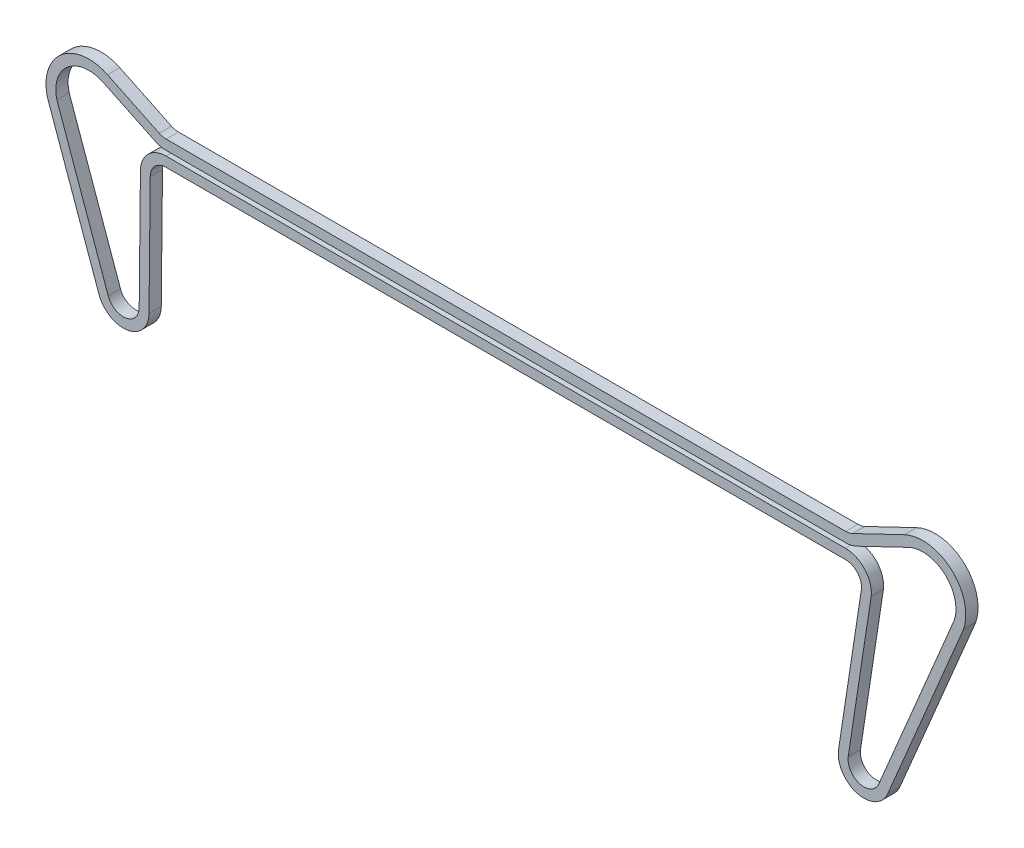
ISO-10303-21;
HEADER;
FILE_DESCRIPTION(('STEP AP214'),'2;1');
FILE_NAME('part.step','',(''),(''),'','','');
FILE_SCHEMA(('AUTOMOTIVE_DESIGN { 1 0 10303 214 1 1 1 1 }'));
ENDSEC;
DATA;
#1=APPLICATION_CONTEXT('core data for automotive mechanical design processes');
#2=APPLICATION_PROTOCOL_DEFINITION('international standard','automotive_design',2000,#1);
#3=PRODUCT_CONTEXT('',#1,'mechanical');
#4=PRODUCT('Part','Part','',(#3));
#5=PRODUCT_RELATED_PRODUCT_CATEGORY('part','',(#4));
#6=PRODUCT_DEFINITION_FORMATION('','',#4);
#7=PRODUCT_DEFINITION_CONTEXT('part definition',#1,'design');
#8=PRODUCT_DEFINITION('design','',#6,#7);
#9=PRODUCT_DEFINITION_SHAPE('','',#8);
#10=(LENGTH_UNIT() NAMED_UNIT(*) SI_UNIT(.MILLI.,.METRE.));
#11=(NAMED_UNIT(*) PLANE_ANGLE_UNIT() SI_UNIT($,.RADIAN.));
#12=(NAMED_UNIT(*) SI_UNIT($,.STERADIAN.) SOLID_ANGLE_UNIT());
#13=UNCERTAINTY_MEASURE_WITH_UNIT(LENGTH_MEASURE(1.E-05),#10,'distance_accuracy_value','');
#14=(GEOMETRIC_REPRESENTATION_CONTEXT(3) GLOBAL_UNCERTAINTY_ASSIGNED_CONTEXT((#13)) GLOBAL_UNIT_ASSIGNED_CONTEXT((#10,
#11,#12)) REPRESENTATION_CONTEXT('',''));
#15=CARTESIAN_POINT('',(0.,0.,0.));
#16=DIRECTION('',(0.,0.,1.));
#17=DIRECTION('',(1.,0.,0.));
#18=AXIS2_PLACEMENT_3D('',#15,#16,#17);
#19=CARTESIAN_POINT('',(31.5000004922709,-11.4999979388587,0.));
#20=DIRECTION('',(0.,0.,-1.));
#21=DIRECTION('',(-1.,0.,0.));
#22=AXIS2_PLACEMENT_3D('',#19,#20,#21);
#23=CYLINDRICAL_SURFACE('',#22,6.5);
#24=CARTESIAN_POINT('',(31.5000004922709,-11.4999979388587,-5.));
#25=DIRECTION('',(0.,0.,1.));
#26=DIRECTION('',(1.,0.,0.));
#27=AXIS2_PLACEMENT_3D('',#24,#25,#26);
#28=CIRCLE('',#27,6.5);
#29=CARTESIAN_POINT('',(31.5000004922709,-4.99999793885871,-5.));
#30=VERTEX_POINT('',#29);
#31=CARTESIAN_POINT('',(25.00000761403,-11.5096199354053,-5.));
#32=VERTEX_POINT('',#31);
#33=EDGE_CURVE('E344',#30,#32,#28,.T.);
#34=ORIENTED_EDGE('',*,*,#33,.F.);
#35=DIRECTION('',(0.,0.,-1.));
#36=VECTOR('',#35,1.);
#37=CARTESIAN_POINT('',(31.5000004922709,-4.99999793885871,0.));
#38=LINE('',#37,#36);
#39=CARTESIAN_POINT('',(31.5000004922709,-4.99999793885871,0.));
#40=VERTEX_POINT('',#39);
#41=EDGE_CURVE('E11',#40,#30,#38,.T.);
#42=ORIENTED_EDGE('',*,*,#41,.F.);
#43=CARTESIAN_POINT('',(31.5000004922709,-11.4999979388587,0.));
#44=DIRECTION('',(0.,0.,1.));
#45=DIRECTION('',(1.,0.,0.));
#46=AXIS2_PLACEMENT_3D('',#43,#44,#45);
#47=CIRCLE('',#46,6.5);
#48=CARTESIAN_POINT('',(25.00000761403,-11.5096199354053,0.));
#49=VERTEX_POINT('',#48);
#50=EDGE_CURVE('E372',#40,#49,#47,.T.);
#51=ORIENTED_EDGE('',*,*,#50,.T.);
#52=DIRECTION('',(0.,0.,-1.));
#53=VECTOR('',#52,1.);
#54=CARTESIAN_POINT('',(25.00000761403,-11.5096199354053,0.));
#55=LINE('',#54,#53);
#56=EDGE_CURVE('E33',#49,#32,#55,.T.);
#57=ORIENTED_EDGE('',*,*,#56,.T.);
#58=EDGE_LOOP('',(#34,#42,#51,#57));
#59=FACE_BOUND('',#58,.T.);
#60=ADVANCED_FACE('F30',(#59),#23,.F.);
#61=CARTESIAN_POINT('',(308.500000492271,-4.99999793885872,0.));
#62=DIRECTION('',(0.,-1.,0.));
#63=DIRECTION('',(1.,0.,0.));
#64=AXIS2_PLACEMENT_3D('',#61,#62,#63);
#65=PLANE('',#64);
#66=DIRECTION('',(-1.,0.,0.));
#67=VECTOR('',#66,1.);
#68=CARTESIAN_POINT('',(308.500000492271,-4.99999793885872,-5.));
#69=LINE('',#68,#67);
#70=CARTESIAN_POINT('',(308.500000492271,-4.99999793885872,-5.));
#71=VERTEX_POINT('',#70);
#72=EDGE_CURVE('E376',#71,#30,#69,.T.);
#73=ORIENTED_EDGE('',*,*,#72,.F.);
#74=DIRECTION('',(0.,0.,-1.));
#75=VECTOR('',#74,1.);
#76=CARTESIAN_POINT('',(308.500000492271,-4.99999793885872,0.));
#77=LINE('',#76,#75);
#78=CARTESIAN_POINT('',(308.500000492271,-4.99999793885872,0.));
#79=VERTEX_POINT('',#78);
#80=EDGE_CURVE('E38',#79,#71,#77,.T.);
#81=ORIENTED_EDGE('',*,*,#80,.F.);
#82=DIRECTION('',(-1.,0.,0.));
#83=VECTOR('',#82,1.);
#84=CARTESIAN_POINT('',(308.500000492271,-4.99999793885872,0.));
#85=LINE('',#84,#83);
#86=EDGE_CURVE('E418',#79,#40,#85,.T.);
#87=ORIENTED_EDGE('',*,*,#86,.T.);
#88=ORIENTED_EDGE('',*,*,#41,.T.);
#89=EDGE_LOOP('',(#73,#81,#87,#88));
#90=FACE_BOUND('',#89,.T.);
#91=ADVANCED_FACE('F505',(#90),#65,.T.);
#92=CARTESIAN_POINT('',(308.500000492271,-11.4999979388587,0.));
#93=DIRECTION('',(0.,0.,-1.));
#94=DIRECTION('',(-1.,0.,0.));
#95=AXIS2_PLACEMENT_3D('',#92,#93,#94);
#96=CYLINDRICAL_SURFACE('',#95,6.5);
#97=CARTESIAN_POINT('',(308.500000492271,-11.4999979388587,-5.));
#98=DIRECTION('',(0.,0.,1.));
#99=DIRECTION('',(1.,0.,0.));
#100=AXIS2_PLACEMENT_3D('',#97,#98,#99);
#101=CIRCLE('',#100,6.5);
#102=CARTESIAN_POINT('',(314.961196040551,-12.2091890886078,-5.));
#103=VERTEX_POINT('',#102);
#104=EDGE_CURVE('E462',#103,#71,#101,.T.);
#105=ORIENTED_EDGE('',*,*,#104,.F.);
#106=DIRECTION('',(0.,0.,-1.));
#107=VECTOR('',#106,1.);
#108=CARTESIAN_POINT('',(314.961196040551,-12.2091890886078,0.));
#109=LINE('',#108,#107);
#110=CARTESIAN_POINT('',(314.961196040551,-12.2091890886078,0.));
#111=VERTEX_POINT('',#110);
#112=EDGE_CURVE('E468',#111,#103,#109,.T.);
#113=ORIENTED_EDGE('',*,*,#112,.F.);
#114=CARTESIAN_POINT('',(308.500000492271,-11.4999979388587,0.));
#115=DIRECTION('',(0.,0.,1.));
#116=DIRECTION('',(1.,0.,0.));
#117=AXIS2_PLACEMENT_3D('',#114,#115,#116);
#118=CIRCLE('',#117,6.5);
#119=EDGE_CURVE('E415',#111,#79,#118,.T.);
#120=ORIENTED_EDGE('',*,*,#119,.T.);
#121=ORIENTED_EDGE('',*,*,#80,.T.);
#122=EDGE_LOOP('',(#105,#113,#120,#121));
#123=FACE_BOUND('',#122,.T.);
#124=ADVANCED_FACE('F556',(#123),#96,.F.);
#125=CARTESIAN_POINT('',(305.620183212539,-73.4158883231644,0.));
#126=DIRECTION('',(-0.988554008208539,0.150867401564525,0.));
#127=DIRECTION('',(-0.150867401564525,-0.988554008208539,0.));
#128=AXIS2_PLACEMENT_3D('',#125,#126,#127);
#129=PLANE('',#128);
#130=DIRECTION('',(0.150867401564525,0.988554008208539,0.));
#131=VECTOR('',#130,1.);
#132=CARTESIAN_POINT('',(305.620183212539,-73.4158883231644,-5.));
#133=LINE('',#132,#131);
#134=CARTESIAN_POINT('',(305.620183212539,-73.4158883231644,-5.));
#135=VERTEX_POINT('',#134);
#136=EDGE_CURVE('E459',#135,#103,#133,.T.);
#137=ORIENTED_EDGE('',*,*,#136,.F.);
#138=DIRECTION('',(0.,0.,-1.));
#139=VECTOR('',#138,1.);
#140=CARTESIAN_POINT('',(305.620183212539,-73.4158883231644,0.));
#141=LINE('',#140,#139);
#142=CARTESIAN_POINT('',(305.620183212539,-73.4158883231644,0.));
#143=VERTEX_POINT('',#142);
#144=EDGE_CURVE('E470',#143,#135,#141,.T.);
#145=ORIENTED_EDGE('',*,*,#144,.F.);
#146=DIRECTION('',(0.150867401564525,0.988554008208539,0.));
#147=VECTOR('',#146,1.);
#148=CARTESIAN_POINT('',(305.620183212539,-73.4158883231644,0.));
#149=LINE('',#148,#147);
#150=EDGE_CURVE('E412',#143,#111,#149,.T.);
#151=ORIENTED_EDGE('',*,*,#150,.T.);
#152=ORIENTED_EDGE('',*,*,#112,.T.);
#153=EDGE_LOOP('',(#137,#145,#151,#152));
#154=FACE_BOUND('',#153,.T.);
#155=ADVANCED_FACE('F554',(#154),#129,.T.);
#156=CARTESIAN_POINT('',(316.,-74.9999959940018,0.));
#157=DIRECTION('',(0.,0.,-1.));
#158=DIRECTION('',(-1.,0.,0.));
#159=AXIS2_PLACEMENT_3D('',#156,#157,#158);
#160=CYLINDRICAL_SURFACE('',#159,10.499999697813);
#161=CARTESIAN_POINT('',(316.,-74.9999959940018,-5.));
#162=DIRECTION('',(0.,0.,-1.));
#163=DIRECTION('',(-1.,0.,0.));
#164=AXIS2_PLACEMENT_3D('',#161,#162,#163);
#165=CIRCLE('',#164,10.499999697813);
#166=CARTESIAN_POINT('',(325.678912559591,-79.0704560807573,-5.));
#167=VERTEX_POINT('',#166);
#168=EDGE_CURVE('E456',#167,#135,#165,.T.);
#169=ORIENTED_EDGE('',*,*,#168,.F.);
#170=DIRECTION('',(0.,0.,-1.));
#171=VECTOR('',#170,1.);
#172=CARTESIAN_POINT('',(325.678912559591,-79.0704560807573,0.));
#173=LINE('',#172,#171);
#174=CARTESIAN_POINT('',(325.678912559591,-79.0704560807573,0.));
#175=VERTEX_POINT('',#174);
#176=EDGE_CURVE('E472',#175,#167,#173,.T.);
#177=ORIENTED_EDGE('',*,*,#176,.F.);
#178=CARTESIAN_POINT('',(316.,-74.9999959940018,0.));
#179=DIRECTION('',(0.,0.,-1.));
#180=DIRECTION('',(-1.,0.,0.));
#181=AXIS2_PLACEMENT_3D('',#178,#179,#180);
#182=CIRCLE('',#181,10.499999697813);
#183=EDGE_CURVE('E409',#175,#143,#182,.T.);
#184=ORIENTED_EDGE('',*,*,#183,.T.);
#185=ORIENTED_EDGE('',*,*,#144,.T.);
#186=EDGE_LOOP('',(#169,#177,#184,#185));
#187=FACE_BOUND('',#186,.T.);
#188=ADVANCED_FACE('F550',(#187),#160,.T.);
#189=CARTESIAN_POINT('',(356.591608654425,-5.56493677677615,0.));
#190=DIRECTION('',(0.921801222680673,-0.38766287656212,0.));
#191=DIRECTION('',(0.38766287656212,0.921801222680673,0.));
#192=AXIS2_PLACEMENT_3D('',#189,#190,#191);
#193=PLANE('',#192);
#194=DIRECTION('',(-0.38766287656212,-0.921801222680672,0.));
#195=VECTOR('',#194,1.);
#196=CARTESIAN_POINT('',(356.591608654425,-5.56493677677615,-5.));
#197=LINE('',#196,#195);
#198=CARTESIAN_POINT('',(356.591608654425,-5.56493677677615,-5.));
#199=VERTEX_POINT('',#198);
#200=EDGE_CURVE('E453',#199,#167,#197,.T.);
#201=ORIENTED_EDGE('',*,*,#200,.F.);
#202=DIRECTION('',(0.,0.,-1.));
#203=VECTOR('',#202,1.);
#204=CARTESIAN_POINT('',(356.591608654425,-5.56493677677615,0.));
#205=LINE('',#204,#203);
#206=CARTESIAN_POINT('',(356.591608654425,-5.56493677677615,0.));
#207=VERTEX_POINT('',#206);
#208=EDGE_CURVE('E474',#207,#199,#205,.T.);
#209=ORIENTED_EDGE('',*,*,#208,.F.);
#210=DIRECTION('',(-0.38766287656212,-0.921801222680672,0.));
#211=VECTOR('',#210,1.);
#212=CARTESIAN_POINT('',(356.591608654425,-5.56493677677615,0.));
#213=LINE('',#212,#211);
#214=EDGE_CURVE('E406',#207,#175,#213,.T.);
#215=ORIENTED_EDGE('',*,*,#214,.T.);
#216=ORIENTED_EDGE('',*,*,#176,.T.);
#217=EDGE_LOOP('',(#201,#209,#215,#216));
#218=FACE_BOUND('',#217,.T.);
#219=ADVANCED_FACE('F546',(#218),#193,.T.);
#220=CARTESIAN_POINT('',(340.000000581422,1.81694398544407E-06,0.));
#221=DIRECTION('',(0.,0.,-1.));
#222=DIRECTION('',(-1.,0.,0.));
#223=AXIS2_PLACEMENT_3D('',#220,#221,#222);
#224=CYLINDRICAL_SURFACE('',#223,17.5);
#225=CARTESIAN_POINT('',(340.000000581422,1.81694398544407E-06,-5.));
#226=DIRECTION('',(0.,0.,-1.));
#227=DIRECTION('',(-1.,0.,0.));
#228=AXIS2_PLACEMENT_3D('',#225,#226,#227);
#229=CIRCLE('',#228,17.5);
#230=CARTESIAN_POINT('',(332.426226108369,15.7761845057737,-5.));
#231=VERTEX_POINT('',#230);
#232=EDGE_CURVE('E450',#231,#199,#229,.T.);
#233=ORIENTED_EDGE('',*,*,#232,.F.);
#234=DIRECTION('',(0.,0.,-1.));
#235=VECTOR('',#234,1.);
#236=CARTESIAN_POINT('',(332.426226108369,15.7761845057737,0.));
#237=LINE('',#236,#235);
#238=CARTESIAN_POINT('',(332.426226108369,15.7761845057737,0.));
#239=VERTEX_POINT('',#238);
#240=EDGE_CURVE('E476',#239,#231,#237,.T.);
#241=ORIENTED_EDGE('',*,*,#240,.F.);
#242=CARTESIAN_POINT('',(340.000000581422,1.81694398544407E-06,0.));
#243=DIRECTION('',(0.,0.,-1.));
#244=DIRECTION('',(-1.,0.,0.));
#245=AXIS2_PLACEMENT_3D('',#242,#243,#244);
#246=CIRCLE('',#245,17.5);
#247=EDGE_CURVE('E403',#239,#207,#246,.T.);
#248=ORIENTED_EDGE('',*,*,#247,.T.);
#249=ORIENTED_EDGE('',*,*,#208,.T.);
#250=EDGE_LOOP('',(#233,#241,#248,#249));
#251=FACE_BOUND('',#250,.T.);
#252=ADVANCED_FACE('F542',(#251),#224,.T.);
#253=CARTESIAN_POINT('',(311.313116903422,5.64027706243306,0.));
#254=DIRECTION('',(-0.432787112745886,0.901496153647413,0.));
#255=DIRECTION('',(-0.901496153647413,-0.432787112745886,0.));
#256=AXIS2_PLACEMENT_3D('',#253,#254,#255);
#257=PLANE('',#256);
#258=DIRECTION('',(0.901496153647413,0.432787112745886,0.));
#259=VECTOR('',#258,1.);
#260=CARTESIAN_POINT('',(311.313116903422,5.64027706243306,-5.));
#261=LINE('',#260,#259);
#262=CARTESIAN_POINT('',(311.313116903422,5.64027706243306,-5.));
#263=VERTEX_POINT('',#262);
#264=EDGE_CURVE('E447',#263,#231,#261,.T.);
#265=ORIENTED_EDGE('',*,*,#264,.F.);
#266=DIRECTION('',(0.,0.,-1.));
#267=VECTOR('',#266,1.);
#268=CARTESIAN_POINT('',(311.313116903422,5.64027706243306,0.));
#269=LINE('',#268,#267);
#270=CARTESIAN_POINT('',(311.313116903422,5.64027706243306,0.));
#271=VERTEX_POINT('',#270);
#272=EDGE_CURVE('E478',#271,#263,#269,.T.);
#273=ORIENTED_EDGE('',*,*,#272,.F.);
#274=DIRECTION('',(0.901496153647413,0.432787112745886,0.));
#275=VECTOR('',#274,1.);
#276=CARTESIAN_POINT('',(311.313116903422,5.64027706243306,0.));
#277=LINE('',#276,#275);
#278=EDGE_CURVE('E400',#271,#239,#277,.T.);
#279=ORIENTED_EDGE('',*,*,#278,.T.);
#280=ORIENTED_EDGE('',*,*,#240,.T.);
#281=EDGE_LOOP('',(#265,#273,#279,#280));
#282=FACE_BOUND('',#281,.T.);
#283=ADVANCED_FACE('F538',(#282),#257,.T.);
#284=CARTESIAN_POINT('',(308.500000670574,11.5000020611413,0.));
#285=DIRECTION('',(0.,0.,-1.));
#286=DIRECTION('',(-1.,0.,0.));
#287=AXIS2_PLACEMENT_3D('',#284,#285,#286);
#288=CYLINDRICAL_SURFACE('',#287,6.5);
#289=CARTESIAN_POINT('',(308.500000670574,11.5000020611413,-5.));
#290=DIRECTION('',(0.,0.,1.));
#291=DIRECTION('',(1.,0.,0.));
#292=AXIS2_PLACEMENT_3D('',#289,#290,#291);
#293=CIRCLE('',#292,6.5);
#294=CARTESIAN_POINT('',(308.500000670574,5.00000206114125,-5.));
#295=VERTEX_POINT('',#294);
#296=EDGE_CURVE('E444',#295,#263,#293,.T.);
#297=ORIENTED_EDGE('',*,*,#296,.F.);
#298=DIRECTION('',(0.,0.,-1.));
#299=VECTOR('',#298,1.);
#300=CARTESIAN_POINT('',(308.500000670574,5.00000206114125,0.));
#301=LINE('',#300,#299);
#302=CARTESIAN_POINT('',(308.500000670574,5.00000206114125,0.));
#303=VERTEX_POINT('',#302);
#304=EDGE_CURVE('E480',#303,#295,#301,.T.);
#305=ORIENTED_EDGE('',*,*,#304,.F.);
#306=CARTESIAN_POINT('',(308.500000670574,11.5000020611413,0.));
#307=DIRECTION('',(0.,0.,1.));
#308=DIRECTION('',(1.,0.,0.));
#309=AXIS2_PLACEMENT_3D('',#306,#307,#308);
#310=CIRCLE('',#309,6.5);
#311=EDGE_CURVE('E397',#303,#271,#310,.T.);
#312=ORIENTED_EDGE('',*,*,#311,.T.);
#313=ORIENTED_EDGE('',*,*,#272,.T.);
#314=EDGE_LOOP('',(#297,#305,#312,#313));
#315=FACE_BOUND('',#314,.T.);
#316=ADVANCED_FACE('F534',(#315),#288,.F.);
#317=CARTESIAN_POINT('',(31.5000006705736,5.00000206114129,0.));
#318=DIRECTION('',(0.,1.,0.));
#319=DIRECTION('',(-1.,0.,0.));
#320=AXIS2_PLACEMENT_3D('',#317,#318,#319);
#321=PLANE('',#320);
#322=DIRECTION('',(1.,0.,0.));
#323=VECTOR('',#322,1.);
#324=CARTESIAN_POINT('',(31.5000006705736,5.00000206114129,-5.));
#325=LINE('',#324,#323);
#326=CARTESIAN_POINT('',(31.5000006705736,5.00000206114129,-5.));
#327=VERTEX_POINT('',#326);
#328=EDGE_CURVE('E441',#327,#295,#325,.T.);
#329=ORIENTED_EDGE('',*,*,#328,.F.);
#330=DIRECTION('',(0.,0.,-1.));
#331=VECTOR('',#330,1.);
#332=CARTESIAN_POINT('',(31.5000006705736,5.00000206114129,0.));
#333=LINE('',#332,#331);
#334=CARTESIAN_POINT('',(31.5000006705736,5.00000206114129,0.));
#335=VERTEX_POINT('',#334);
#336=EDGE_CURVE('E482',#335,#327,#333,.T.);
#337=ORIENTED_EDGE('',*,*,#336,.F.);
#338=DIRECTION('',(1.,0.,0.));
#339=VECTOR('',#338,1.);
#340=CARTESIAN_POINT('',(31.5000006705736,5.00000206114129,0.));
#341=LINE('',#340,#339);
#342=EDGE_CURVE('E394',#335,#303,#341,.T.);
#343=ORIENTED_EDGE('',*,*,#342,.T.);
#344=ORIENTED_EDGE('',*,*,#304,.T.);
#345=EDGE_LOOP('',(#329,#337,#343,#344));
#346=FACE_BOUND('',#345,.T.);
#347=ADVANCED_FACE('F530',(#346),#321,.T.);
#348=CARTESIAN_POINT('',(31.5000006705736,11.5000020611413,0.));
#349=DIRECTION('',(0.,0.,-1.));
#350=DIRECTION('',(-1.,0.,0.));
#351=AXIS2_PLACEMENT_3D('',#348,#349,#350);
#352=CYLINDRICAL_SURFACE('',#351,6.5);
#353=CARTESIAN_POINT('',(31.5000006705736,11.5000020611413,-5.));
#354=DIRECTION('',(0.,0.,1.));
#355=DIRECTION('',(1.,0.,0.));
#356=AXIS2_PLACEMENT_3D('',#353,#354,#355);
#357=CIRCLE('',#356,6.5);
#358=CARTESIAN_POINT('',(28.6868843468727,5.64027710604932,-5.));
#359=VERTEX_POINT('',#358);
#360=EDGE_CURVE('E438',#359,#327,#357,.T.);
#361=ORIENTED_EDGE('',*,*,#360,.F.);
#362=DIRECTION('',(0.,0.,-1.));
#363=VECTOR('',#362,1.);
#364=CARTESIAN_POINT('',(28.6868843468727,5.64027710604932,0.));
#365=LINE('',#364,#363);
#366=CARTESIAN_POINT('',(28.6868843468727,5.64027710604932,0.));
#367=VERTEX_POINT('',#366);
#368=EDGE_CURVE('E484',#367,#359,#365,.T.);
#369=ORIENTED_EDGE('',*,*,#368,.F.);
#370=CARTESIAN_POINT('',(31.5000006705736,11.5000020611413,0.));
#371=DIRECTION('',(0.,0.,1.));
#372=DIRECTION('',(1.,0.,0.));
#373=AXIS2_PLACEMENT_3D('',#370,#371,#372);
#374=CIRCLE('',#373,6.5);
#375=EDGE_CURVE('E391',#367,#335,#374,.T.);
#376=ORIENTED_EDGE('',*,*,#375,.T.);
#377=ORIENTED_EDGE('',*,*,#336,.T.);
#378=EDGE_LOOP('',(#361,#369,#376,#377));
#379=FACE_BOUND('',#378,.T.);
#380=ADVANCED_FACE('F526',(#379),#352,.F.);
#381=CARTESIAN_POINT('',(7.57377529907849,15.77618487674,0.));
#382=DIRECTION('',(0.432787126723214,0.901496146937226,0.));
#383=DIRECTION('',(-0.901496146937226,0.432787126723214,0.));
#384=AXIS2_PLACEMENT_3D('',#381,#382,#383);
#385=PLANE('',#384);
#386=DIRECTION('',(0.901496146937226,-0.432787126723214,0.));
#387=VECTOR('',#386,1.);
#388=CARTESIAN_POINT('',(7.57377529907849,15.77618487674,-5.));
#389=LINE('',#388,#387);
#390=CARTESIAN_POINT('',(7.57377529907849,15.77618487674,-5.));
#391=VERTEX_POINT('',#390);
#392=EDGE_CURVE('E435',#391,#359,#389,.T.);
#393=ORIENTED_EDGE('',*,*,#392,.F.);
#394=DIRECTION('',(0.,0.,-1.));
#395=VECTOR('',#394,1.);
#396=CARTESIAN_POINT('',(7.57377529907849,15.77618487674,0.));
#397=LINE('',#396,#395);
#398=CARTESIAN_POINT('',(7.57377529907849,15.77618487674,0.));
#399=VERTEX_POINT('',#398);
#400=EDGE_CURVE('E486',#399,#391,#397,.T.);
#401=ORIENTED_EDGE('',*,*,#400,.F.);
#402=DIRECTION('',(0.901496146937226,-0.432787126723214,0.));
#403=VECTOR('',#402,1.);
#404=CARTESIAN_POINT('',(7.57377529907849,15.77618487674,0.));
#405=LINE('',#404,#403);
#406=EDGE_CURVE('E388',#399,#367,#405,.T.);
#407=ORIENTED_EDGE('',*,*,#406,.T.);
#408=ORIENTED_EDGE('',*,*,#368,.T.);
#409=EDGE_LOOP('',(#393,#401,#407,#408));
#410=FACE_BOUND('',#409,.T.);
#411=ADVANCED_FACE('F522',(#410),#385,.T.);
#412=CARTESIAN_POINT('',(5.81422252357577E-07,2.30533856847986E-06,0.));
#413=DIRECTION('',(0.,0.,-1.));
#414=DIRECTION('',(-1.,0.,0.));
#415=AXIS2_PLACEMENT_3D('',#412,#413,#414);
#416=CYLINDRICAL_SURFACE('',#415,17.5);
#417=CARTESIAN_POINT('',(5.81422252357577E-07,2.30533856847986E-06,-5.));
#418=DIRECTION('',(0.,0.,-1.));
#419=DIRECTION('',(-1.,0.,0.));
#420=AXIS2_PLACEMENT_3D('',#417,#418,#419);
#421=CIRCLE('',#420,17.5);
#422=CARTESIAN_POINT('',(-16.8918014647731,-4.57351096480176,-5.));
#423=VERTEX_POINT('',#422);
#424=EDGE_CURVE('E432',#423,#391,#421,.T.);
#425=ORIENTED_EDGE('',*,*,#424,.F.);
#426=DIRECTION('',(0.,0.,-1.));
#427=VECTOR('',#426,1.);
#428=CARTESIAN_POINT('',(-16.8918014647731,-4.57351096480176,0.));
#429=LINE('',#428,#427);
#430=CARTESIAN_POINT('',(-16.8918014647731,-4.57351096480176,0.));
#431=VERTEX_POINT('',#430);
#432=EDGE_CURVE('E488',#431,#423,#429,.T.);
#433=ORIENTED_EDGE('',*,*,#432,.F.);
#434=CARTESIAN_POINT('',(5.81422252357577E-07,2.30533856847986E-06,0.));
#435=DIRECTION('',(0.,0.,-1.));
#436=DIRECTION('',(-1.,0.,0.));
#437=AXIS2_PLACEMENT_3D('',#434,#435,#436);
#438=CIRCLE('',#437,17.5);
#439=EDGE_CURVE('E385',#431,#399,#438,.T.);
#440=ORIENTED_EDGE('',*,*,#439,.T.);
#441=ORIENTED_EDGE('',*,*,#400,.T.);
#442=EDGE_LOOP('',(#425,#433,#440,#441));
#443=FACE_BOUND('',#442,.T.);
#444=ADVANCED_FACE('F518',(#443),#416,.T.);
#445=CARTESIAN_POINT('',(4.10890071035716,-63.5236539359714,0.));
#446=DIRECTION('',(-0.942009467231181,-0.33558629835979,0.));
#447=DIRECTION('',(0.33558629835979,-0.942009467231181,0.));
#448=AXIS2_PLACEMENT_3D('',#445,#446,#447);
#449=PLANE('',#448);
#450=DIRECTION('',(-0.33558629835979,0.942009467231181,0.));
#451=VECTOR('',#450,1.);
#452=CARTESIAN_POINT('',(4.10890071035716,-63.5236539359714,-5.));
#453=LINE('',#452,#451);
#454=CARTESIAN_POINT('',(4.10890071035716,-63.5236539359714,-5.));
#455=VERTEX_POINT('',#454);
#456=EDGE_CURVE('E429',#455,#423,#453,.T.);
#457=ORIENTED_EDGE('',*,*,#456,.F.);
#458=DIRECTION('',(0.,0.,-1.));
#459=VECTOR('',#458,1.);
#460=CARTESIAN_POINT('',(4.10890071035716,-63.5236539359714,0.));
#461=LINE('',#460,#459);
#462=CARTESIAN_POINT('',(4.10890071035716,-63.5236539359714,0.));
#463=VERTEX_POINT('',#462);
#464=EDGE_CURVE('E490',#463,#455,#461,.T.);
#465=ORIENTED_EDGE('',*,*,#464,.F.);
#466=DIRECTION('',(-0.33558629835979,0.942009467231181,0.));
#467=VECTOR('',#466,1.);
#468=CARTESIAN_POINT('',(4.10890071035716,-63.5236539359714,0.));
#469=LINE('',#468,#467);
#470=EDGE_CURVE('E382',#463,#431,#469,.T.);
#471=ORIENTED_EDGE('',*,*,#470,.T.);
#472=ORIENTED_EDGE('',*,*,#432,.T.);
#473=EDGE_LOOP('',(#457,#465,#471,#472));
#474=FACE_BOUND('',#473,.T.);
#475=ADVANCED_FACE('F516',(#474),#449,.T.);
#476=CARTESIAN_POINT('',(14.0000001162846,-59.9999978031936,0.));
#477=DIRECTION('',(0.,0.,-1.));
#478=DIRECTION('',(-1.,0.,0.));
#479=AXIS2_PLACEMENT_3D('',#476,#477,#478);
#480=CYLINDRICAL_SURFACE('',#479,10.5);
#481=CARTESIAN_POINT('',(14.0000001162846,-59.9999978031936,-5.));
#482=DIRECTION('',(0.,0.,-1.));
#483=DIRECTION('',(-1.,0.,0.));
#484=AXIS2_PLACEMENT_3D('',#481,#482,#483);
#485=CIRCLE('',#484,10.5);
#486=CARTESIAN_POINT('',(24.4999945027763,-60.010855226596,-5.));
#487=VERTEX_POINT('',#486);
#488=EDGE_CURVE('E426',#487,#455,#485,.T.);
#489=ORIENTED_EDGE('',*,*,#488,.F.);
#490=DIRECTION('',(0.,0.,-1.));
#491=VECTOR('',#490,1.);
#492=CARTESIAN_POINT('',(24.4999945027763,-60.010855226596,0.));
#493=LINE('',#492,#491);
#494=CARTESIAN_POINT('',(24.4999945027763,-60.010855226596,0.));
#495=VERTEX_POINT('',#494);
#496=EDGE_CURVE('E491',#495,#487,#493,.T.);
#497=ORIENTED_EDGE('',*,*,#496,.F.);
#498=CARTESIAN_POINT('',(14.0000001162846,-59.9999978031936,0.));
#499=DIRECTION('',(0.,0.,-1.));
#500=DIRECTION('',(-1.,0.,0.));
#501=AXIS2_PLACEMENT_3D('',#498,#499,#500);
#502=CIRCLE('',#501,10.5);
#503=EDGE_CURVE('E379',#495,#463,#502,.T.);
#504=ORIENTED_EDGE('',*,*,#503,.T.);
#505=ORIENTED_EDGE('',*,*,#464,.T.);
#506=EDGE_LOOP('',(#489,#497,#504,#505));
#507=FACE_BOUND('',#506,.T.);
#508=ADVANCED_FACE('F512',(#507),#480,.T.);
#509=CARTESIAN_POINT('',(25.00000761403,-11.5096199354053,0.));
#510=DIRECTION('',(0.999946863545486,-0.0103087383100237,0.));
#511=DIRECTION('',(0.0103087383100237,0.999946863545486,0.));
#512=AXIS2_PLACEMENT_3D('',#509,#510,#511);
#513=PLANE('',#512);
#514=DIRECTION('',(-0.0103087383100237,-0.999946863545486,0.));
#515=VECTOR('',#514,1.);
#516=CARTESIAN_POINT('',(25.00000761403,-11.5096199354053,-5.));
#517=LINE('',#516,#515);
#518=EDGE_CURVE('E423',#32,#487,#517,.T.);
#519=ORIENTED_EDGE('',*,*,#518,.F.);
#520=ORIENTED_EDGE('',*,*,#56,.F.);
#521=DIRECTION('',(-0.0103087383100237,-0.999946863545486,0.));
#522=VECTOR('',#521,1.);
#523=CARTESIAN_POINT('',(25.00000761403,-11.5096199354053,0.));
#524=LINE('',#523,#522);
#525=EDGE_CURVE('E375',#49,#495,#524,.T.);
#526=ORIENTED_EDGE('',*,*,#525,.T.);
#527=ORIENTED_EDGE('',*,*,#496,.T.);
#528=EDGE_LOOP('',(#519,#520,#526,#527));
#529=FACE_BOUND('',#528,.T.);
#530=ADVANCED_FACE('F499',(#529),#513,.T.);
#531=CARTESIAN_POINT('',(31.5000004922709,-11.4999979388587,0.));
#532=DIRECTION('',(0.,0.,1.));
#533=DIRECTION('',(1.,0.,0.));
#534=AXIS2_PLACEMENT_3D('',#531,#532,#533);
#535=PLANE('',#534);
#536=CARTESIAN_POINT('',(31.5000004922709,-11.4999979388587,0.));
#537=DIRECTION('',(0.,0.,1.));
#538=DIRECTION('',(-1.,0.,0.));
#539=AXIS2_PLACEMENT_3D('',#536,#537,#538);
#540=CIRCLE('',#539,10.5000000000002);
#541=CARTESIAN_POINT('',(31.5000004922709,-0.999997938858504,0.));
#542=VERTEX_POINT('',#541);
#543=CARTESIAN_POINT('',(21.000006096938,-11.489149068795,0.));
#544=VERTEX_POINT('',#543);
#545=EDGE_CURVE('E241',#542,#544,#540,.T.);
#546=ORIENTED_EDGE('',*,*,#545,.T.);
#547=DIRECTION('',(-0.0103087383100215,-0.999946863545486,0.));
#548=VECTOR('',#547,1.);
#549=CARTESIAN_POINT('',(20.499993004484,-59.9903825364191,0.));
#550=LINE('',#549,#548);
#551=CARTESIAN_POINT('',(20.499993004484,-59.9903825364191,0.));
#552=VERTEX_POINT('',#551);
#553=EDGE_CURVE('E250',#544,#552,#550,.T.);
#554=ORIENTED_EDGE('',*,*,#553,.T.);
#555=CARTESIAN_POINT('',(14.0000001162846,-59.9999978031936,0.));
#556=DIRECTION('',(0.,0.,-1.));
#557=DIRECTION('',(1.,0.,0.));
#558=AXIS2_PLACEMENT_3D('',#555,#556,#557);
#559=CIRCLE('',#558,6.4999999999999);
#560=CARTESIAN_POINT('',(7.87693857928198,-62.1813087425322,0.));
#561=VERTEX_POINT('',#560);
#562=EDGE_CURVE('E46',#552,#561,#559,.T.);
#563=ORIENTED_EDGE('',*,*,#562,.T.);
#564=DIRECTION('',(-0.33558629835979,0.942009467231181,0.));
#565=VECTOR('',#564,1.);
#566=CARTESIAN_POINT('',(-13.0681197235776,-3.38736122608957,0.));
#567=LINE('',#566,#565);
#568=CARTESIAN_POINT('',(-13.0681197235776,-3.38736122608957,0.));
#569=VERTEX_POINT('',#568);
#570=EDGE_CURVE('E265',#561,#569,#567,.T.);
#571=ORIENTED_EDGE('',*,*,#570,.T.);
#572=CARTESIAN_POINT('',(5.81422252357577E-07,2.30533856847986E-06,0.));
#573=DIRECTION('',(0.,0.,-1.));
#574=DIRECTION('',(1.,0.,0.));
#575=AXIS2_PLACEMENT_3D('',#572,#573,#574);
#576=CIRCLE('',#575,13.4999999999999);
#577=CARTESIAN_POINT('',(5.84262679218559,12.170200288991,0.));
#578=VERTEX_POINT('',#577);
#579=EDGE_CURVE('E268',#569,#578,#576,.T.);
#580=ORIENTED_EDGE('',*,*,#579,.T.);
#581=DIRECTION('',(0.901496146937226,-0.432787126723213,0.));
#582=VECTOR('',#581,1.);
#583=CARTESIAN_POINT('',(26.9557358399799,2.03429251830033,0.));
#584=LINE('',#583,#582);
#585=CARTESIAN_POINT('',(26.9557358399799,2.03429251830033,0.));
#586=VERTEX_POINT('',#585);
#587=EDGE_CURVE('E271',#578,#586,#584,.T.);
#588=ORIENTED_EDGE('',*,*,#587,.T.);
#589=CARTESIAN_POINT('',(31.5000006705736,11.5000020611413,0.));
#590=DIRECTION('',(0.,0.,1.));
#591=DIRECTION('',(-1.,0.,0.));
#592=AXIS2_PLACEMENT_3D('',#589,#590,#591);
#593=CIRCLE('',#592,10.5000000000001);
#594=CARTESIAN_POINT('',(31.5000006705736,1.0000020611412,0.));
#595=VERTEX_POINT('',#594);
#596=EDGE_CURVE('E274',#586,#595,#593,.T.);
#597=ORIENTED_EDGE('',*,*,#596,.T.);
#598=DIRECTION('',(1.,0.,0.));
#599=VECTOR('',#598,1.);
#600=CARTESIAN_POINT('',(308.500000670574,1.0000020611412,0.));
#601=LINE('',#600,#599);
#602=CARTESIAN_POINT('',(308.500000670574,1.0000020611412,0.));
#603=VERTEX_POINT('',#602);
#604=EDGE_CURVE('E277',#595,#603,#601,.T.);
#605=ORIENTED_EDGE('',*,*,#604,.T.);
#606=CARTESIAN_POINT('',(308.500000670574,11.5000020611413,0.));
#607=DIRECTION('',(0.,0.,1.));
#608=DIRECTION('',(-1.,0.,0.));
#609=AXIS2_PLACEMENT_3D('',#606,#607,#608);
#610=CIRCLE('',#609,10.5000000000001);
#611=CARTESIAN_POINT('',(313.044265354405,2.03429244784338,0.));
#612=VERTEX_POINT('',#611);
#613=EDGE_CURVE('E280',#603,#612,#610,.T.);
#614=ORIENTED_EDGE('',*,*,#613,.T.);
#615=DIRECTION('',(0.901496153647413,0.432787112745886,0.));
#616=VECTOR('',#615,1.);
#617=CARTESIAN_POINT('',(334.157374559353,12.170199891184,0.));
#618=LINE('',#617,#616);
#619=CARTESIAN_POINT('',(334.157374559353,12.170199891184,0.));
#620=VERTEX_POINT('',#619);
#621=EDGE_CURVE('E283',#612,#620,#618,.T.);
#622=ORIENTED_EDGE('',*,*,#621,.T.);
#623=CARTESIAN_POINT('',(340.000000581422,1.81694398544407E-06,0.));
#624=DIRECTION('',(0.,0.,-1.));
#625=DIRECTION('',(1.,0.,0.));
#626=AXIS2_PLACEMENT_3D('',#623,#624,#625);
#627=CIRCLE('',#626,13.5);
#628=CARTESIAN_POINT('',(352.842882509675,-4.16057311651959,0.));
#629=VERTEX_POINT('',#628);
#630=EDGE_CURVE('E286',#620,#629,#627,.T.);
#631=ORIENTED_EDGE('',*,*,#630,.T.);
#632=DIRECTION('',(-0.38766287656212,-0.921801222680672,0.));
#633=VECTOR('',#632,1.);
#634=CARTESIAN_POINT('',(321.991707668868,-77.5198045745089,0.));
#635=LINE('',#634,#633);
#636=CARTESIAN_POINT('',(321.991707668868,-77.5198045745089,0.));
#637=VERTEX_POINT('',#636);
#638=EDGE_CURVE('E289',#629,#637,#635,.T.);
#639=ORIENTED_EDGE('',*,*,#638,.T.);
#640=CARTESIAN_POINT('',(316.,-74.9999959940018,0.));
#641=DIRECTION('',(0.,0.,-1.));
#642=DIRECTION('',(1.,0.,0.));
#643=AXIS2_PLACEMENT_3D('',#640,#641,#642);
#644=CIRCLE('',#643,6.49999969781298);
#645=CARTESIAN_POINT('',(309.574399245373,-74.0193579294225,0.));
#646=VERTEX_POINT('',#645);
#647=EDGE_CURVE('E292',#637,#646,#644,.T.);
#648=ORIENTED_EDGE('',*,*,#647,.T.);
#649=DIRECTION('',(0.150867401564526,0.988554008208539,0.));
#650=VECTOR('',#649,1.);
#651=CARTESIAN_POINT('',(318.926606245345,-12.7393092274225,0.));
#652=LINE('',#651,#650);
#653=CARTESIAN_POINT('',(318.926606245345,-12.7393092274225,0.));
#654=VERTEX_POINT('',#653);
#655=EDGE_CURVE('E295',#646,#654,#652,.T.);
#656=ORIENTED_EDGE('',*,*,#655,.T.);
#657=CARTESIAN_POINT('',(308.500000492271,-11.4999979388587,0.));
#658=DIRECTION('',(0.,0.,1.));
#659=DIRECTION('',(-1.,0.,0.));
#660=AXIS2_PLACEMENT_3D('',#657,#658,#659);
#661=CIRCLE('',#660,10.5000000000001);
#662=CARTESIAN_POINT('',(308.500000492271,-0.999997938858665,0.));
#663=VERTEX_POINT('',#662);
#664=EDGE_CURVE('E298',#654,#663,#661,.T.);
#665=ORIENTED_EDGE('',*,*,#664,.T.);
#666=DIRECTION('',(-1.,0.,0.));
#667=VECTOR('',#666,1.);
#668=CARTESIAN_POINT('',(31.5000004922709,-0.999997938858504,0.));
#669=LINE('',#668,#667);
#670=EDGE_CURVE('E247',#663,#542,#669,.T.);
#671=ORIENTED_EDGE('',*,*,#670,.T.);
#672=EDGE_LOOP('',(#546,#554,#563,#571,#580,#588,#597,#605,#614,#622,#631,#639,#648,#656,#665,#671));
#673=FACE_BOUND('',#672,.T.);
#674=ORIENTED_EDGE('',*,*,#50,.F.);
#675=ORIENTED_EDGE('',*,*,#86,.F.);
#676=ORIENTED_EDGE('',*,*,#119,.F.);
#677=ORIENTED_EDGE('',*,*,#150,.F.);
#678=ORIENTED_EDGE('',*,*,#183,.F.);
#679=ORIENTED_EDGE('',*,*,#214,.F.);
#680=ORIENTED_EDGE('',*,*,#247,.F.);
#681=ORIENTED_EDGE('',*,*,#278,.F.);
#682=ORIENTED_EDGE('',*,*,#311,.F.);
#683=ORIENTED_EDGE('',*,*,#342,.F.);
#684=ORIENTED_EDGE('',*,*,#375,.F.);
#685=ORIENTED_EDGE('',*,*,#406,.F.);
#686=ORIENTED_EDGE('',*,*,#439,.F.);
#687=ORIENTED_EDGE('',*,*,#470,.F.);
#688=ORIENTED_EDGE('',*,*,#503,.F.);
#689=ORIENTED_EDGE('',*,*,#525,.F.);
#690=EDGE_LOOP('',(#674,#675,#676,#677,#678,#679,#680,#681,#682,#683,#684,#685,#686,#687,#688,#689));
#691=FACE_BOUND('',#690,.T.);
#692=ADVANCED_FACE('F254',(#673,#691),#535,.T.);
#693=CARTESIAN_POINT('',(31.5000004922709,-11.4999979388587,-5.));
#694=DIRECTION('',(0.,0.,1.));
#695=DIRECTION('',(1.,0.,0.));
#696=AXIS2_PLACEMENT_3D('',#693,#694,#695);
#697=PLANE('',#696);
#698=DIRECTION('',(-0.0103087383100215,-0.999946863545486,0.));
#699=VECTOR('',#698,1.);
#700=CARTESIAN_POINT('',(20.499993004484,-59.9903825364191,-5.));
#701=LINE('',#700,#699);
#702=CARTESIAN_POINT('',(21.000006096938,-11.489149068795,-5.));
#703=VERTEX_POINT('',#702);
#704=CARTESIAN_POINT('',(20.499993004484,-59.9903825364191,-5.));
#705=VERTEX_POINT('',#704);
#706=EDGE_CURVE('E302',#703,#705,#701,.T.);
#707=ORIENTED_EDGE('',*,*,#706,.F.);
#708=CARTESIAN_POINT('',(31.5000004922709,-11.4999979388587,-5.));
#709=DIRECTION('',(0.,0.,1.));
#710=DIRECTION('',(-1.,0.,0.));
#711=AXIS2_PLACEMENT_3D('',#708,#709,#710);
#712=CIRCLE('',#711,10.5000000000002);
#713=CARTESIAN_POINT('',(31.5000004922709,-0.999997938858504,-5.));
#714=VERTEX_POINT('',#713);
#715=EDGE_CURVE('E54',#714,#703,#712,.T.);
#716=ORIENTED_EDGE('',*,*,#715,.F.);
#717=DIRECTION('',(-1.,0.,0.));
#718=VECTOR('',#717,1.);
#719=CARTESIAN_POINT('',(31.5000004922709,-0.999997938858504,-5.));
#720=LINE('',#719,#718);
#721=CARTESIAN_POINT('',(308.500000492271,-0.999997938858665,-5.));
#722=VERTEX_POINT('',#721);
#723=EDGE_CURVE('E258',#722,#714,#720,.T.);
#724=ORIENTED_EDGE('',*,*,#723,.F.);
#725=CARTESIAN_POINT('',(308.500000492271,-11.4999979388587,-5.));
#726=DIRECTION('',(0.,0.,1.));
#727=DIRECTION('',(-1.,0.,0.));
#728=AXIS2_PLACEMENT_3D('',#725,#726,#727);
#729=CIRCLE('',#728,10.5000000000001);
#730=CARTESIAN_POINT('',(318.926606245345,-12.7393092274225,-5.));
#731=VERTEX_POINT('',#730);
#732=EDGE_CURVE('E261',#731,#722,#729,.T.);
#733=ORIENTED_EDGE('',*,*,#732,.F.);
#734=DIRECTION('',(0.150867401564526,0.988554008208539,0.));
#735=VECTOR('',#734,1.);
#736=CARTESIAN_POINT('',(318.926606245345,-12.7393092274225,-5.));
#737=LINE('',#736,#735);
#738=CARTESIAN_POINT('',(309.574399245373,-74.0193579294225,-5.));
#739=VERTEX_POINT('',#738);
#740=EDGE_CURVE('E337',#739,#731,#737,.T.);
#741=ORIENTED_EDGE('',*,*,#740,.F.);
#742=CARTESIAN_POINT('',(316.,-74.9999959940018,-5.));
#743=DIRECTION('',(0.,0.,-1.));
#744=DIRECTION('',(1.,0.,0.));
#745=AXIS2_PLACEMENT_3D('',#742,#743,#744);
#746=CIRCLE('',#745,6.49999969781298);
#747=CARTESIAN_POINT('',(321.991707668868,-77.5198045745089,-5.));
#748=VERTEX_POINT('',#747);
#749=EDGE_CURVE('E334',#748,#739,#746,.T.);
#750=ORIENTED_EDGE('',*,*,#749,.F.);
#751=DIRECTION('',(-0.38766287656212,-0.921801222680672,0.));
#752=VECTOR('',#751,1.);
#753=CARTESIAN_POINT('',(321.991707668868,-77.5198045745089,-5.));
#754=LINE('',#753,#752);
#755=CARTESIAN_POINT('',(352.842882509675,-4.16057311651959,-5.));
#756=VERTEX_POINT('',#755);
#757=EDGE_CURVE('E331',#756,#748,#754,.T.);
#758=ORIENTED_EDGE('',*,*,#757,.F.);
#759=CARTESIAN_POINT('',(340.000000581422,1.81694398544407E-06,-5.));
#760=DIRECTION('',(0.,0.,-1.));
#761=DIRECTION('',(1.,0.,0.));
#762=AXIS2_PLACEMENT_3D('',#759,#760,#761);
#763=CIRCLE('',#762,13.5);
#764=CARTESIAN_POINT('',(334.157374559353,12.170199891184,-5.));
#765=VERTEX_POINT('',#764);
#766=EDGE_CURVE('E328',#765,#756,#763,.T.);
#767=ORIENTED_EDGE('',*,*,#766,.F.);
#768=DIRECTION('',(0.901496153647413,0.432787112745886,0.));
#769=VECTOR('',#768,1.);
#770=CARTESIAN_POINT('',(334.157374559353,12.170199891184,-5.));
#771=LINE('',#770,#769);
#772=CARTESIAN_POINT('',(313.044265354405,2.03429244784338,-5.));
#773=VERTEX_POINT('',#772);
#774=EDGE_CURVE('E325',#773,#765,#771,.T.);
#775=ORIENTED_EDGE('',*,*,#774,.F.);
#776=CARTESIAN_POINT('',(308.500000670574,11.5000020611413,-5.));
#777=DIRECTION('',(0.,0.,1.));
#778=DIRECTION('',(-1.,0.,0.));
#779=AXIS2_PLACEMENT_3D('',#776,#777,#778);
#780=CIRCLE('',#779,10.5000000000001);
#781=CARTESIAN_POINT('',(308.500000670574,1.0000020611412,-5.));
#782=VERTEX_POINT('',#781);
#783=EDGE_CURVE('E322',#782,#773,#780,.T.);
#784=ORIENTED_EDGE('',*,*,#783,.F.);
#785=DIRECTION('',(1.,0.,0.));
#786=VECTOR('',#785,1.);
#787=CARTESIAN_POINT('',(308.500000670574,1.0000020611412,-5.));
#788=LINE('',#787,#786);
#789=CARTESIAN_POINT('',(31.5000006705736,1.0000020611412,-5.));
#790=VERTEX_POINT('',#789);
#791=EDGE_CURVE('E319',#790,#782,#788,.T.);
#792=ORIENTED_EDGE('',*,*,#791,.F.);
#793=CARTESIAN_POINT('',(31.5000006705736,11.5000020611413,-5.));
#794=DIRECTION('',(0.,0.,1.));
#795=DIRECTION('',(-1.,0.,0.));
#796=AXIS2_PLACEMENT_3D('',#793,#794,#795);
#797=CIRCLE('',#796,10.5000000000001);
#798=CARTESIAN_POINT('',(26.9557358399799,2.03429251830033,-5.));
#799=VERTEX_POINT('',#798);
#800=EDGE_CURVE('E316',#799,#790,#797,.T.);
#801=ORIENTED_EDGE('',*,*,#800,.F.);
#802=DIRECTION('',(0.901496146937226,-0.432787126723213,0.));
#803=VECTOR('',#802,1.);
#804=CARTESIAN_POINT('',(26.9557358399799,2.03429251830033,-5.));
#805=LINE('',#804,#803);
#806=CARTESIAN_POINT('',(5.84262679218559,12.170200288991,-5.));
#807=VERTEX_POINT('',#806);
#808=EDGE_CURVE('E313',#807,#799,#805,.T.);
#809=ORIENTED_EDGE('',*,*,#808,.F.);
#810=CARTESIAN_POINT('',(5.81422252357577E-07,2.30533856847986E-06,-5.));
#811=DIRECTION('',(0.,0.,-1.));
#812=DIRECTION('',(1.,0.,0.));
#813=AXIS2_PLACEMENT_3D('',#810,#811,#812);
#814=CIRCLE('',#813,13.4999999999999);
#815=CARTESIAN_POINT('',(-13.0681197235776,-3.38736122608957,-5.));
#816=VERTEX_POINT('',#815);
#817=EDGE_CURVE('E310',#816,#807,#814,.T.);
#818=ORIENTED_EDGE('',*,*,#817,.F.);
#819=DIRECTION('',(-0.33558629835979,0.942009467231181,0.));
#820=VECTOR('',#819,1.);
#821=CARTESIAN_POINT('',(-13.0681197235776,-3.38736122608957,-5.));
#822=LINE('',#821,#820);
#823=CARTESIAN_POINT('',(7.87693857928198,-62.1813087425322,-5.));
#824=VERTEX_POINT('',#823);
#825=EDGE_CURVE('E307',#824,#816,#822,.T.);
#826=ORIENTED_EDGE('',*,*,#825,.F.);
#827=CARTESIAN_POINT('',(14.0000001162846,-59.9999978031936,-5.));
#828=DIRECTION('',(0.,0.,-1.));
#829=DIRECTION('',(1.,0.,0.));
#830=AXIS2_PLACEMENT_3D('',#827,#828,#829);
#831=CIRCLE('',#830,6.4999999999999);
#832=EDGE_CURVE('E304',#705,#824,#831,.T.);
#833=ORIENTED_EDGE('',*,*,#832,.F.);
#834=EDGE_LOOP('',(#707,#716,#724,#733,#741,#750,#758,#767,#775,#784,#792,#801,#809,#818,#826,#833));
#835=FACE_BOUND('',#834,.T.);
#836=ORIENTED_EDGE('',*,*,#33,.T.);
#837=ORIENTED_EDGE('',*,*,#518,.T.);
#838=ORIENTED_EDGE('',*,*,#488,.T.);
#839=ORIENTED_EDGE('',*,*,#456,.T.);
#840=ORIENTED_EDGE('',*,*,#424,.T.);
#841=ORIENTED_EDGE('',*,*,#392,.T.);
#842=ORIENTED_EDGE('',*,*,#360,.T.);
#843=ORIENTED_EDGE('',*,*,#328,.T.);
#844=ORIENTED_EDGE('',*,*,#296,.T.);
#845=ORIENTED_EDGE('',*,*,#264,.T.);
#846=ORIENTED_EDGE('',*,*,#232,.T.);
#847=ORIENTED_EDGE('',*,*,#200,.T.);
#848=ORIENTED_EDGE('',*,*,#168,.T.);
#849=ORIENTED_EDGE('',*,*,#136,.T.);
#850=ORIENTED_EDGE('',*,*,#104,.T.);
#851=ORIENTED_EDGE('',*,*,#72,.T.);
#852=EDGE_LOOP('',(#836,#837,#838,#839,#840,#841,#842,#843,#844,#845,#846,#847,#848,#849,#850,#851));
#853=FACE_BOUND('',#852,.T.);
#854=ADVANCED_FACE('F501',(#835,#853),#697,.F.);
#855=CARTESIAN_POINT('',(31.5000004922709,-11.4999979388587,0.));
#856=DIRECTION('',(0.,0.,-1.));
#857=DIRECTION('',(-1.,0.,0.));
#858=AXIS2_PLACEMENT_3D('',#855,#856,#857);
#859=CYLINDRICAL_SURFACE('',#858,10.5000000000002);
#860=ORIENTED_EDGE('',*,*,#715,.T.);
#861=DIRECTION('',(0.,0.,-1.));
#862=VECTOR('',#861,1.);
#863=CARTESIAN_POINT('',(21.000006096938,-11.489149068795,0.));
#864=LINE('',#863,#862);
#865=EDGE_CURVE('E237',#544,#703,#864,.T.);
#866=ORIENTED_EDGE('',*,*,#865,.F.);
#867=ORIENTED_EDGE('',*,*,#545,.F.);
#868=DIRECTION('',(0.,0.,-1.));
#869=VECTOR('',#868,1.);
#870=CARTESIAN_POINT('',(31.5000004922709,-0.999997938858504,0.));
#871=LINE('',#870,#869);
#872=EDGE_CURVE('E342',#542,#714,#871,.T.);
#873=ORIENTED_EDGE('',*,*,#872,.T.);
#874=EDGE_LOOP('',(#860,#866,#867,#873));
#875=FACE_BOUND('',#874,.T.);
#876=ADVANCED_FACE('F239',(#875),#859,.T.);
#877=CARTESIAN_POINT('',(31.5000004922709,-0.999997938858504,0.));
#878=DIRECTION('',(0.,-1.,0.));
#879=DIRECTION('',(1.,0.,0.));
#880=AXIS2_PLACEMENT_3D('',#877,#878,#879);
#881=PLANE('',#880);
#882=ORIENTED_EDGE('',*,*,#723,.T.);
#883=ORIENTED_EDGE('',*,*,#872,.F.);
#884=ORIENTED_EDGE('',*,*,#670,.F.);
#885=DIRECTION('',(0.,0.,-1.));
#886=VECTOR('',#885,1.);
#887=CARTESIAN_POINT('',(308.500000492271,-0.999997938858665,0.));
#888=LINE('',#887,#886);
#889=EDGE_CURVE('E345',#663,#722,#888,.T.);
#890=ORIENTED_EDGE('',*,*,#889,.T.);
#891=EDGE_LOOP('',(#882,#883,#884,#890));
#892=FACE_BOUND('',#891,.T.);
#893=ADVANCED_FACE('F703',(#892),#881,.F.);
#894=CARTESIAN_POINT('',(308.500000492271,-11.4999979388587,0.));
#895=DIRECTION('',(0.,0.,-1.));
#896=DIRECTION('',(-1.,0.,0.));
#897=AXIS2_PLACEMENT_3D('',#894,#895,#896);
#898=CYLINDRICAL_SURFACE('',#897,10.5000000000001);
#899=ORIENTED_EDGE('',*,*,#732,.T.);
#900=ORIENTED_EDGE('',*,*,#889,.F.);
#901=ORIENTED_EDGE('',*,*,#664,.F.);
#902=DIRECTION('',(0.,0.,-1.));
#903=VECTOR('',#902,1.);
#904=CARTESIAN_POINT('',(318.926606245345,-12.7393092274225,0.));
#905=LINE('',#904,#903);
#906=EDGE_CURVE('E347',#654,#731,#905,.T.);
#907=ORIENTED_EDGE('',*,*,#906,.T.);
#908=EDGE_LOOP('',(#899,#900,#901,#907));
#909=FACE_BOUND('',#908,.T.);
#910=ADVANCED_FACE('F712',(#909),#898,.T.);
#911=CARTESIAN_POINT('',(318.926606245345,-12.7393092274225,0.));
#912=DIRECTION('',(-0.988554008208539,0.150867401564526,0.));
#913=DIRECTION('',(-0.150867401564526,-0.988554008208539,0.));
#914=AXIS2_PLACEMENT_3D('',#911,#912,#913);
#915=PLANE('',#914);
#916=ORIENTED_EDGE('',*,*,#740,.T.);
#917=ORIENTED_EDGE('',*,*,#906,.F.);
#918=ORIENTED_EDGE('',*,*,#655,.F.);
#919=DIRECTION('',(0.,0.,-1.));
#920=VECTOR('',#919,1.);
#921=CARTESIAN_POINT('',(309.574399245373,-74.0193579294225,0.));
#922=LINE('',#921,#920);
#923=EDGE_CURVE('E349',#646,#739,#922,.T.);
#924=ORIENTED_EDGE('',*,*,#923,.T.);
#925=EDGE_LOOP('',(#916,#917,#918,#924));
#926=FACE_BOUND('',#925,.T.);
#927=ADVANCED_FACE('F722',(#926),#915,.F.);
#928=CARTESIAN_POINT('',(316.,-74.9999959940018,0.));
#929=DIRECTION('',(0.,0.,-1.));
#930=DIRECTION('',(-1.,0.,0.));
#931=AXIS2_PLACEMENT_3D('',#928,#929,#930);
#932=CYLINDRICAL_SURFACE('',#931,6.49999969781298);
#933=ORIENTED_EDGE('',*,*,#749,.T.);
#934=ORIENTED_EDGE('',*,*,#923,.F.);
#935=ORIENTED_EDGE('',*,*,#647,.F.);
#936=DIRECTION('',(0.,0.,-1.));
#937=VECTOR('',#936,1.);
#938=CARTESIAN_POINT('',(321.991707668868,-77.5198045745089,0.));
#939=LINE('',#938,#937);
#940=EDGE_CURVE('E351',#637,#748,#939,.T.);
#941=ORIENTED_EDGE('',*,*,#940,.T.);
#942=EDGE_LOOP('',(#933,#934,#935,#941));
#943=FACE_BOUND('',#942,.T.);
#944=ADVANCED_FACE('F732',(#943),#932,.F.);
#945=CARTESIAN_POINT('',(321.991707668868,-77.5198045745089,0.));
#946=DIRECTION('',(0.921801222680672,-0.38766287656212,0.));
#947=DIRECTION('',(0.38766287656212,0.921801222680672,0.));
#948=AXIS2_PLACEMENT_3D('',#945,#946,#947);
#949=PLANE('',#948);
#950=ORIENTED_EDGE('',*,*,#757,.T.);
#951=ORIENTED_EDGE('',*,*,#940,.F.);
#952=ORIENTED_EDGE('',*,*,#638,.F.);
#953=DIRECTION('',(0.,0.,-1.));
#954=VECTOR('',#953,1.);
#955=CARTESIAN_POINT('',(352.842882509675,-4.16057311651959,0.));
#956=LINE('',#955,#954);
#957=EDGE_CURVE('E353',#629,#756,#956,.T.);
#958=ORIENTED_EDGE('',*,*,#957,.T.);
#959=EDGE_LOOP('',(#950,#951,#952,#958));
#960=FACE_BOUND('',#959,.T.);
#961=ADVANCED_FACE('F742',(#960),#949,.F.);
#962=CARTESIAN_POINT('',(340.000000581422,1.81694398544407E-06,0.));
#963=DIRECTION('',(0.,0.,-1.));
#964=DIRECTION('',(-1.,0.,0.));
#965=AXIS2_PLACEMENT_3D('',#962,#963,#964);
#966=CYLINDRICAL_SURFACE('',#965,13.5);
#967=ORIENTED_EDGE('',*,*,#766,.T.);
#968=ORIENTED_EDGE('',*,*,#957,.F.);
#969=ORIENTED_EDGE('',*,*,#630,.F.);
#970=DIRECTION('',(0.,0.,-1.));
#971=VECTOR('',#970,1.);
#972=CARTESIAN_POINT('',(334.157374559353,12.170199891184,0.));
#973=LINE('',#972,#971);
#974=EDGE_CURVE('E355',#620,#765,#973,.T.);
#975=ORIENTED_EDGE('',*,*,#974,.T.);
#976=EDGE_LOOP('',(#967,#968,#969,#975));
#977=FACE_BOUND('',#976,.T.);
#978=ADVANCED_FACE('F752',(#977),#966,.F.);
#979=CARTESIAN_POINT('',(334.157374559353,12.170199891184,0.));
#980=DIRECTION('',(-0.432787112745886,0.901496153647413,0.));
#981=DIRECTION('',(-0.901496153647413,-0.432787112745886,0.));
#982=AXIS2_PLACEMENT_3D('',#979,#980,#981);
#983=PLANE('',#982);
#984=ORIENTED_EDGE('',*,*,#774,.T.);
#985=ORIENTED_EDGE('',*,*,#974,.F.);
#986=ORIENTED_EDGE('',*,*,#621,.F.);
#987=DIRECTION('',(0.,0.,-1.));
#988=VECTOR('',#987,1.);
#989=CARTESIAN_POINT('',(313.044265354405,2.03429244784338,0.));
#990=LINE('',#989,#988);
#991=EDGE_CURVE('E357',#612,#773,#990,.T.);
#992=ORIENTED_EDGE('',*,*,#991,.T.);
#993=EDGE_LOOP('',(#984,#985,#986,#992));
#994=FACE_BOUND('',#993,.T.);
#995=ADVANCED_FACE('F762',(#994),#983,.F.);
#996=CARTESIAN_POINT('',(308.500000670574,11.5000020611413,0.));
#997=DIRECTION('',(0.,0.,-1.));
#998=DIRECTION('',(-1.,0.,0.));
#999=AXIS2_PLACEMENT_3D('',#996,#997,#998);
#1000=CYLINDRICAL_SURFACE('',#999,10.5000000000001);
#1001=ORIENTED_EDGE('',*,*,#783,.T.);
#1002=ORIENTED_EDGE('',*,*,#991,.F.);
#1003=ORIENTED_EDGE('',*,*,#613,.F.);
#1004=DIRECTION('',(0.,0.,-1.));
#1005=VECTOR('',#1004,1.);
#1006=CARTESIAN_POINT('',(308.500000670574,1.0000020611412,0.));
#1007=LINE('',#1006,#1005);
#1008=EDGE_CURVE('E359',#603,#782,#1007,.T.);
#1009=ORIENTED_EDGE('',*,*,#1008,.T.);
#1010=EDGE_LOOP('',(#1001,#1002,#1003,#1009));
#1011=FACE_BOUND('',#1010,.T.);
#1012=ADVANCED_FACE('F772',(#1011),#1000,.T.);
#1013=CARTESIAN_POINT('',(308.500000670574,1.0000020611412,0.));
#1014=DIRECTION('',(0.,1.,0.));
#1015=DIRECTION('',(-1.,0.,0.));
#1016=AXIS2_PLACEMENT_3D('',#1013,#1014,#1015);
#1017=PLANE('',#1016);
#1018=ORIENTED_EDGE('',*,*,#791,.T.);
#1019=ORIENTED_EDGE('',*,*,#1008,.F.);
#1020=ORIENTED_EDGE('',*,*,#604,.F.);
#1021=DIRECTION('',(0.,0.,-1.));
#1022=VECTOR('',#1021,1.);
#1023=CARTESIAN_POINT('',(31.5000006705736,1.0000020611412,0.));
#1024=LINE('',#1023,#1022);
#1025=EDGE_CURVE('E361',#595,#790,#1024,.T.);
#1026=ORIENTED_EDGE('',*,*,#1025,.T.);
#1027=EDGE_LOOP('',(#1018,#1019,#1020,#1026));
#1028=FACE_BOUND('',#1027,.T.);
#1029=ADVANCED_FACE('F782',(#1028),#1017,.F.);
#1030=CARTESIAN_POINT('',(31.5000006705736,11.5000020611413,0.));
#1031=DIRECTION('',(0.,0.,-1.));
#1032=DIRECTION('',(-1.,0.,0.));
#1033=AXIS2_PLACEMENT_3D('',#1030,#1031,#1032);
#1034=CYLINDRICAL_SURFACE('',#1033,10.5000000000001);
#1035=ORIENTED_EDGE('',*,*,#800,.T.);
#1036=ORIENTED_EDGE('',*,*,#1025,.F.);
#1037=ORIENTED_EDGE('',*,*,#596,.F.);
#1038=DIRECTION('',(0.,0.,-1.));
#1039=VECTOR('',#1038,1.);
#1040=CARTESIAN_POINT('',(26.9557358399799,2.03429251830033,0.));
#1041=LINE('',#1040,#1039);
#1042=EDGE_CURVE('E363',#586,#799,#1041,.T.);
#1043=ORIENTED_EDGE('',*,*,#1042,.T.);
#1044=EDGE_LOOP('',(#1035,#1036,#1037,#1043));
#1045=FACE_BOUND('',#1044,.T.);
#1046=ADVANCED_FACE('F792',(#1045),#1034,.T.);
#1047=CARTESIAN_POINT('',(26.9557358399799,2.03429251830033,0.));
#1048=DIRECTION('',(0.432787126723213,0.901496146937226,0.));
#1049=DIRECTION('',(-0.901496146937226,0.432787126723213,0.));
#1050=AXIS2_PLACEMENT_3D('',#1047,#1048,#1049);
#1051=PLANE('',#1050);
#1052=ORIENTED_EDGE('',*,*,#808,.T.);
#1053=ORIENTED_EDGE('',*,*,#1042,.F.);
#1054=ORIENTED_EDGE('',*,*,#587,.F.);
#1055=DIRECTION('',(0.,0.,-1.));
#1056=VECTOR('',#1055,1.);
#1057=CARTESIAN_POINT('',(5.84262679218559,12.170200288991,0.));
#1058=LINE('',#1057,#1056);
#1059=EDGE_CURVE('E365',#578,#807,#1058,.T.);
#1060=ORIENTED_EDGE('',*,*,#1059,.T.);
#1061=EDGE_LOOP('',(#1052,#1053,#1054,#1060));
#1062=FACE_BOUND('',#1061,.T.);
#1063=ADVANCED_FACE('F802',(#1062),#1051,.F.);
#1064=CARTESIAN_POINT('',(5.81422252357577E-07,2.30533856847986E-06,0.));
#1065=DIRECTION('',(0.,0.,-1.));
#1066=DIRECTION('',(-1.,0.,0.));
#1067=AXIS2_PLACEMENT_3D('',#1064,#1065,#1066);
#1068=CYLINDRICAL_SURFACE('',#1067,13.4999999999999);
#1069=ORIENTED_EDGE('',*,*,#817,.T.);
#1070=ORIENTED_EDGE('',*,*,#1059,.F.);
#1071=ORIENTED_EDGE('',*,*,#579,.F.);
#1072=DIRECTION('',(0.,0.,-1.));
#1073=VECTOR('',#1072,1.);
#1074=CARTESIAN_POINT('',(-13.0681197235776,-3.38736122608957,0.));
#1075=LINE('',#1074,#1073);
#1076=EDGE_CURVE('E367',#569,#816,#1075,.T.);
#1077=ORIENTED_EDGE('',*,*,#1076,.T.);
#1078=EDGE_LOOP('',(#1069,#1070,#1071,#1077));
#1079=FACE_BOUND('',#1078,.T.);
#1080=ADVANCED_FACE('F812',(#1079),#1068,.F.);
#1081=CARTESIAN_POINT('',(-13.0681197235776,-3.38736122608957,0.));
#1082=DIRECTION('',(-0.942009467231181,-0.33558629835979,0.));
#1083=DIRECTION('',(0.33558629835979,-0.942009467231181,0.));
#1084=AXIS2_PLACEMENT_3D('',#1081,#1082,#1083);
#1085=PLANE('',#1084);
#1086=ORIENTED_EDGE('',*,*,#825,.T.);
#1087=ORIENTED_EDGE('',*,*,#1076,.F.);
#1088=ORIENTED_EDGE('',*,*,#570,.F.);
#1089=DIRECTION('',(0.,0.,-1.));
#1090=VECTOR('',#1089,1.);
#1091=CARTESIAN_POINT('',(7.87693857928198,-62.1813087425322,0.));
#1092=LINE('',#1091,#1090);
#1093=EDGE_CURVE('E369',#561,#824,#1092,.T.);
#1094=ORIENTED_EDGE('',*,*,#1093,.T.);
#1095=EDGE_LOOP('',(#1086,#1087,#1088,#1094));
#1096=FACE_BOUND('',#1095,.T.);
#1097=ADVANCED_FACE('F822',(#1096),#1085,.F.);
#1098=CARTESIAN_POINT('',(14.0000001162846,-59.9999978031936,0.));
#1099=DIRECTION('',(0.,0.,-1.));
#1100=DIRECTION('',(-1.,0.,0.));
#1101=AXIS2_PLACEMENT_3D('',#1098,#1099,#1100);
#1102=CYLINDRICAL_SURFACE('',#1101,6.4999999999999);
#1103=ORIENTED_EDGE('',*,*,#832,.T.);
#1104=ORIENTED_EDGE('',*,*,#1093,.F.);
#1105=ORIENTED_EDGE('',*,*,#562,.F.);
#1106=DIRECTION('',(0.,0.,-1.));
#1107=VECTOR('',#1106,1.);
#1108=CARTESIAN_POINT('',(20.499993004484,-59.9903825364191,0.));
#1109=LINE('',#1108,#1107);
#1110=EDGE_CURVE('E246',#552,#705,#1109,.T.);
#1111=ORIENTED_EDGE('',*,*,#1110,.T.);
#1112=EDGE_LOOP('',(#1103,#1104,#1105,#1111));
#1113=FACE_BOUND('',#1112,.T.);
#1114=ADVANCED_FACE('F832',(#1113),#1102,.F.);
#1115=CARTESIAN_POINT('',(20.499993004484,-59.9903825364191,0.));
#1116=DIRECTION('',(0.999946863545486,-0.0103087383100215,0.));
#1117=DIRECTION('',(0.0103087383100215,0.999946863545486,0.));
#1118=AXIS2_PLACEMENT_3D('',#1115,#1116,#1117);
#1119=PLANE('',#1118);
#1120=ORIENTED_EDGE('',*,*,#706,.T.);
#1121=ORIENTED_EDGE('',*,*,#1110,.F.);
#1122=ORIENTED_EDGE('',*,*,#553,.F.);
#1123=ORIENTED_EDGE('',*,*,#865,.T.);
#1124=EDGE_LOOP('',(#1120,#1121,#1122,#1123));
#1125=FACE_BOUND('',#1124,.T.);
#1126=ADVANCED_FACE('F251',(#1125),#1119,.F.);
#1127=CLOSED_SHELL('',(#60,#91,#124,#155,#188,#219,#252,#283,#316,#347,#380,#411,#444,#475,#508,
#530,#692,#854,#876,#893,#910,#927,#944,#961,#978,#995,#1012,#1029,#1046,#1063,#1080,#1097,
#1114,#1126));
#1128=MANIFOLD_SOLID_BREP('B2',#1127);
#1129=ADVANCED_BREP_SHAPE_REPRESENTATION('',(#18,#1128),#14);
#1130=SHAPE_DEFINITION_REPRESENTATION(#9,#1129);
ENDSEC;
END-ISO-10303-21;
